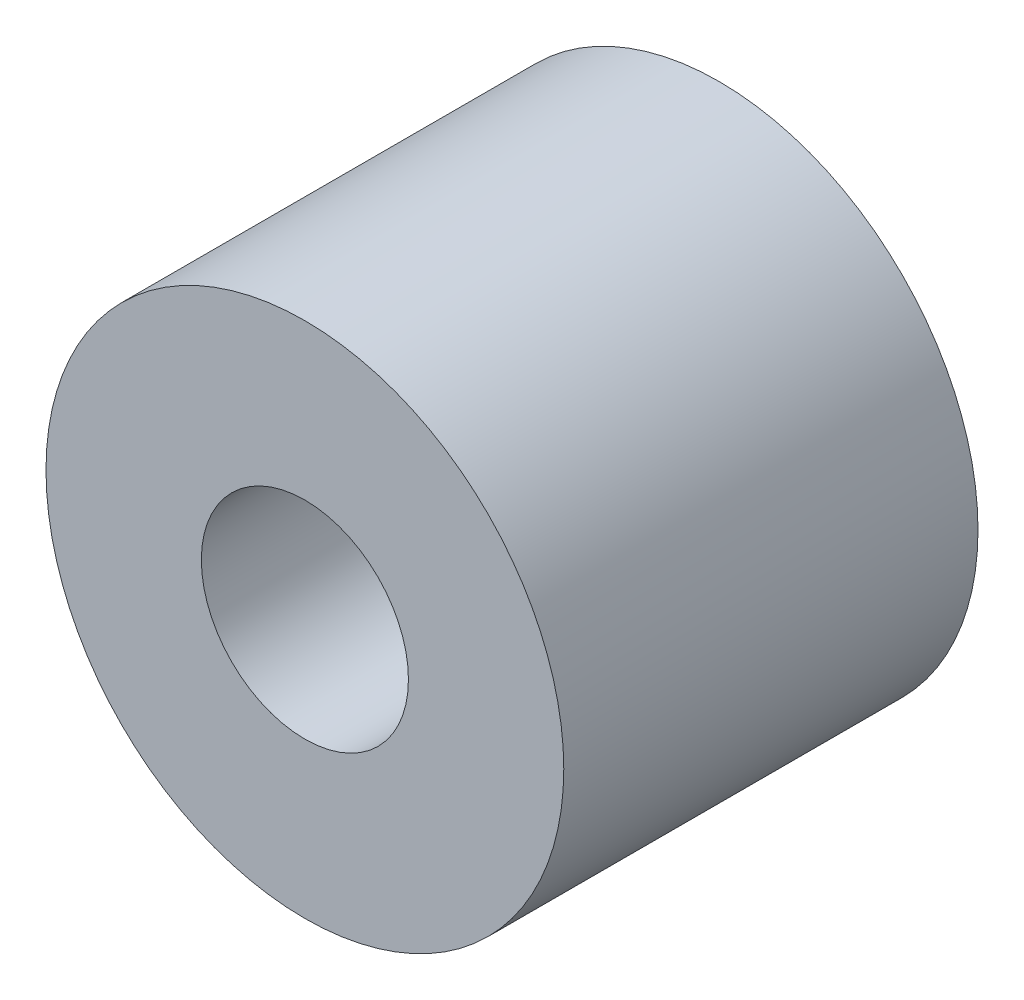
ISO-10303-21;
HEADER;
FILE_DESCRIPTION(('STEP AP214'),'2;1');
FILE_NAME('part.step','',(''),(''),'','','');
FILE_SCHEMA(('AUTOMOTIVE_DESIGN { 1 0 10303 214 1 1 1 1 }'));
ENDSEC;
DATA;
#1=APPLICATION_CONTEXT('core data for automotive mechanical design processes');
#2=APPLICATION_PROTOCOL_DEFINITION('international standard','automotive_design',2000,#1);
#3=PRODUCT_CONTEXT('',#1,'mechanical');
#4=PRODUCT('Part','Part','',(#3));
#5=PRODUCT_RELATED_PRODUCT_CATEGORY('part','',(#4));
#6=PRODUCT_DEFINITION_FORMATION('','',#4);
#7=PRODUCT_DEFINITION_CONTEXT('part definition',#1,'design');
#8=PRODUCT_DEFINITION('design','',#6,#7);
#9=PRODUCT_DEFINITION_SHAPE('','',#8);
#10=(LENGTH_UNIT() NAMED_UNIT(*) SI_UNIT(.MILLI.,.METRE.));
#11=(NAMED_UNIT(*) PLANE_ANGLE_UNIT() SI_UNIT($,.RADIAN.));
#12=(NAMED_UNIT(*) SI_UNIT($,.STERADIAN.) SOLID_ANGLE_UNIT());
#13=UNCERTAINTY_MEASURE_WITH_UNIT(LENGTH_MEASURE(1.E-05),#10,'distance_accuracy_value','');
#14=(GEOMETRIC_REPRESENTATION_CONTEXT(3) GLOBAL_UNCERTAINTY_ASSIGNED_CONTEXT((#13)) GLOBAL_UNIT_ASSIGNED_CONTEXT((#10,
#11,#12)) REPRESENTATION_CONTEXT('',''));
#15=CARTESIAN_POINT('',(0.,0.,0.));
#16=DIRECTION('',(0.,0.,1.));
#17=DIRECTION('',(1.,0.,0.));
#18=AXIS2_PLACEMENT_3D('',#15,#16,#17);
#19=CARTESIAN_POINT('',(0.,0.,40.));
#20=DIRECTION('',(0.,0.,-1.));
#21=DIRECTION('',(-1.,0.,0.));
#22=AXIS2_PLACEMENT_3D('',#19,#20,#21);
#23=CYLINDRICAL_SURFACE('',#22,25.);
#24=CARTESIAN_POINT('',(0.,0.,40.));
#25=DIRECTION('',(0.,0.,1.));
#26=DIRECTION('',(1.,0.,0.));
#27=AXIS2_PLACEMENT_3D('',#24,#25,#26);
#28=CIRCLE('',#27,25.);
#29=CARTESIAN_POINT('',(25.,0.,40.));
#30=VERTEX_POINT('',#29);
#31=EDGE_CURVE('E10',#30,#30,#28,.T.);
#32=ORIENTED_EDGE('',*,*,#31,.F.);
#33=EDGE_LOOP('',(#32));
#34=FACE_BOUND('',#33,.T.);
#35=CARTESIAN_POINT('',(0.,0.,0.));
#36=DIRECTION('',(0.,0.,1.));
#37=DIRECTION('',(1.,0.,0.));
#38=AXIS2_PLACEMENT_3D('',#35,#36,#37);
#39=CIRCLE('',#38,25.);
#40=CARTESIAN_POINT('',(25.,0.,0.));
#41=VERTEX_POINT('',#40);
#42=EDGE_CURVE('E34',#41,#41,#39,.T.);
#43=ORIENTED_EDGE('',*,*,#42,.T.);
#44=EDGE_LOOP('',(#43));
#45=FACE_BOUND('',#44,.T.);
#46=ADVANCED_FACE('F31',(#34,#45),#23,.T.);
#47=CARTESIAN_POINT('',(0.,0.,40.));
#48=DIRECTION('',(0.,0.,1.));
#49=DIRECTION('',(1.,0.,0.));
#50=AXIS2_PLACEMENT_3D('',#47,#48,#49);
#51=PLANE('',#50);
#52=CARTESIAN_POINT('',(0.,0.,40.));
#53=DIRECTION('',(0.,0.,1.));
#54=DIRECTION('',(1.,0.,0.));
#55=AXIS2_PLACEMENT_3D('',#52,#53,#54);
#56=CIRCLE('',#55,10.);
#57=CARTESIAN_POINT('',(10.,0.,40.));
#58=VERTEX_POINT('',#57);
#59=EDGE_CURVE('E43',#58,#58,#56,.T.);
#60=ORIENTED_EDGE('',*,*,#59,.F.);
#61=EDGE_LOOP('',(#60));
#62=FACE_BOUND('',#61,.T.);
#63=ORIENTED_EDGE('',*,*,#31,.T.);
#64=EDGE_LOOP('',(#63));
#65=FACE_BOUND('',#64,.T.);
#66=ADVANCED_FACE('F58',(#62,#65),#51,.T.);
#67=CARTESIAN_POINT('',(0.,0.,0.));
#68=DIRECTION('',(0.,0.,1.));
#69=DIRECTION('',(1.,0.,0.));
#70=AXIS2_PLACEMENT_3D('',#67,#68,#69);
#71=PLANE('',#70);
#72=ORIENTED_EDGE('',*,*,#42,.F.);
#73=EDGE_LOOP('',(#72));
#74=FACE_BOUND('',#73,.T.);
#75=ADVANCED_FACE('F54',(#74),#71,.F.);
#76=CARTESIAN_POINT('',(0.,0.,10.));
#77=DIRECTION('',(0.,0.,1.));
#78=DIRECTION('',(1.,0.,0.));
#79=AXIS2_PLACEMENT_3D('',#76,#77,#78);
#80=CYLINDRICAL_SURFACE('',#79,10.);
#81=CARTESIAN_POINT('',(0.,0.,10.));
#82=DIRECTION('',(0.,0.,1.));
#83=DIRECTION('',(1.,0.,0.));
#84=AXIS2_PLACEMENT_3D('',#81,#82,#83);
#85=CIRCLE('',#84,10.);
#86=CARTESIAN_POINT('',(10.,0.,10.));
#87=VERTEX_POINT('',#86);
#88=EDGE_CURVE('E41',#87,#87,#85,.T.);
#89=ORIENTED_EDGE('',*,*,#88,.F.);
#90=EDGE_LOOP('',(#89));
#91=FACE_BOUND('',#90,.T.);
#92=ORIENTED_EDGE('',*,*,#59,.T.);
#93=EDGE_LOOP('',(#92));
#94=FACE_BOUND('',#93,.T.);
#95=ADVANCED_FACE('F51',(#91,#94),#80,.F.);
#96=CARTESIAN_POINT('',(0.,0.,10.));
#97=DIRECTION('',(0.,0.,1.));
#98=DIRECTION('',(1.,0.,0.));
#99=AXIS2_PLACEMENT_3D('',#96,#97,#98);
#100=PLANE('',#99);
#101=ORIENTED_EDGE('',*,*,#88,.T.);
#102=EDGE_LOOP('',(#101));
#103=FACE_BOUND('',#102,.T.);
#104=ADVANCED_FACE('F49',(#103),#100,.T.);
#105=CLOSED_SHELL('',(#46,#66,#75,#95,#104));
#106=MANIFOLD_SOLID_BREP('B2',#105);
#107=ADVANCED_BREP_SHAPE_REPRESENTATION('',(#18,#106),#14);
#108=SHAPE_DEFINITION_REPRESENTATION(#9,#107);
ENDSEC;
END-ISO-10303-21;
